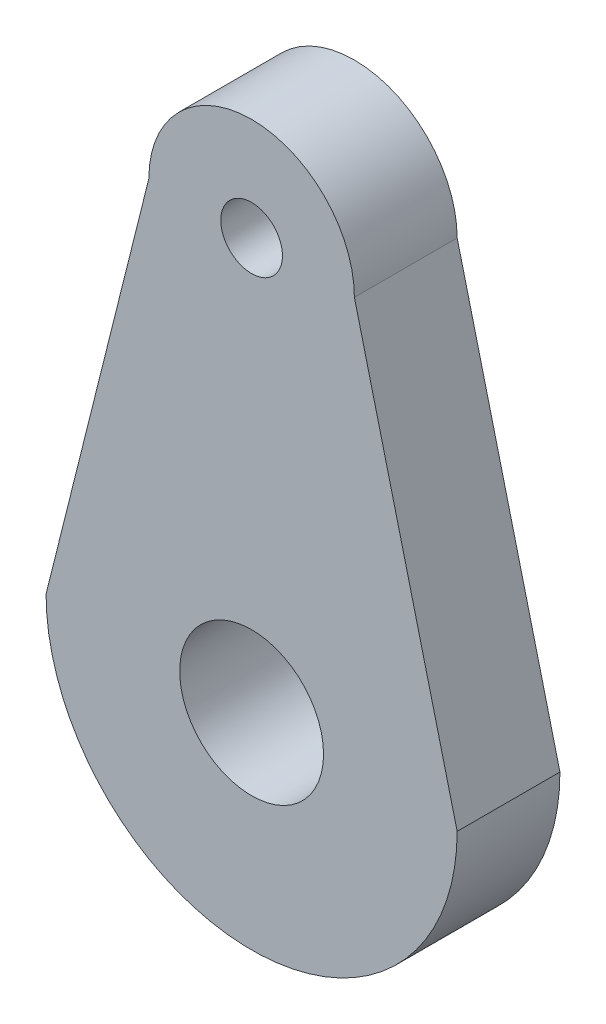
ISO-10303-21;
HEADER;
FILE_DESCRIPTION(('STEP AP214'),'2;1');
FILE_NAME('part.step','',(''),(''),'','','');
FILE_SCHEMA(('AUTOMOTIVE_DESIGN { 1 0 10303 214 1 1 1 1 }'));
ENDSEC;
DATA;
#1=APPLICATION_CONTEXT('core data for automotive mechanical design processes');
#2=APPLICATION_PROTOCOL_DEFINITION('international standard','automotive_design',2000,#1);
#3=PRODUCT_CONTEXT('',#1,'mechanical');
#4=PRODUCT('Part','Part','',(#3));
#5=PRODUCT_RELATED_PRODUCT_CATEGORY('part','',(#4));
#6=PRODUCT_DEFINITION_FORMATION('','',#4);
#7=PRODUCT_DEFINITION_CONTEXT('part definition',#1,'design');
#8=PRODUCT_DEFINITION('design','',#6,#7);
#9=PRODUCT_DEFINITION_SHAPE('','',#8);
#10=(LENGTH_UNIT() NAMED_UNIT(*) SI_UNIT(.MILLI.,.METRE.));
#11=(NAMED_UNIT(*) PLANE_ANGLE_UNIT() SI_UNIT($,.RADIAN.));
#12=(NAMED_UNIT(*) SI_UNIT($,.STERADIAN.) SOLID_ANGLE_UNIT());
#13=UNCERTAINTY_MEASURE_WITH_UNIT(LENGTH_MEASURE(1.E-05),#10,'distance_accuracy_value','');
#14=(GEOMETRIC_REPRESENTATION_CONTEXT(3) GLOBAL_UNCERTAINTY_ASSIGNED_CONTEXT((#13)) GLOBAL_UNIT_ASSIGNED_CONTEXT((#10,
#11,#12)) REPRESENTATION_CONTEXT('',''));
#15=CARTESIAN_POINT('',(0.,0.,0.));
#16=DIRECTION('',(0.,0.,1.));
#17=DIRECTION('',(1.,0.,0.));
#18=AXIS2_PLACEMENT_3D('',#15,#16,#17);
#19=CARTESIAN_POINT('',(0.,10.,5.));
#20=DIRECTION('',(0.,0.,1.));
#21=DIRECTION('',(1.,0.,0.));
#22=AXIS2_PLACEMENT_3D('',#19,#20,#21);
#23=PLANE('',#22);
#24=CARTESIAN_POINT('',(0.,-9.99999999999999,5.));
#25=DIRECTION('',(0.,0.,1.));
#26=DIRECTION('',(1.,0.,0.));
#27=AXIS2_PLACEMENT_3D('',#24,#25,#26);
#28=CIRCLE('',#27,3.5);
#29=CARTESIAN_POINT('',(3.5,-9.99999999999999,5.));
#30=VERTEX_POINT('',#29);
#31=EDGE_CURVE('E102',#30,#30,#28,.T.);
#32=ORIENTED_EDGE('',*,*,#31,.F.);
#33=EDGE_LOOP('',(#32));
#34=FACE_BOUND('',#33,.T.);
#35=CARTESIAN_POINT('',(0.,10.,5.));
#36=DIRECTION('',(0.,0.,1.));
#37=DIRECTION('',(1.,0.,0.));
#38=AXIS2_PLACEMENT_3D('',#35,#36,#37);
#39=CIRCLE('',#38,5.);
#40=CARTESIAN_POINT('',(5.,10.,5.));
#41=VERTEX_POINT('',#40);
#42=CARTESIAN_POINT('',(-5.,10.,5.));
#43=VERTEX_POINT('',#42);
#44=EDGE_CURVE('E87',#41,#43,#39,.T.);
#45=ORIENTED_EDGE('',*,*,#44,.T.);
#46=DIRECTION('',(-0.242535625036333,-0.970142500145332,0.));
#47=VECTOR('',#46,1.);
#48=CARTESIAN_POINT('',(-5.,10.,5.));
#49=LINE('',#48,#47);
#50=CARTESIAN_POINT('',(-10.,-9.99999999999999,5.));
#51=VERTEX_POINT('',#50);
#52=EDGE_CURVE('E82',#43,#51,#49,.T.);
#53=ORIENTED_EDGE('',*,*,#52,.T.);
#54=CARTESIAN_POINT('',(0.,-9.99999999999999,5.));
#55=DIRECTION('',(0.,0.,1.));
#56=DIRECTION('',(1.,0.,0.));
#57=AXIS2_PLACEMENT_3D('',#54,#55,#56);
#58=CIRCLE('',#57,10.);
#59=CARTESIAN_POINT('',(10.,-9.99999999999999,5.));
#60=VERTEX_POINT('',#59);
#61=EDGE_CURVE('E85',#51,#60,#58,.T.);
#62=ORIENTED_EDGE('',*,*,#61,.T.);
#63=DIRECTION('',(-0.242535625036333,0.970142500145332,0.));
#64=VECTOR('',#63,1.);
#65=CARTESIAN_POINT('',(5.,10.,5.));
#66=LINE('',#65,#64);
#67=EDGE_CURVE('E52',#60,#41,#66,.T.);
#68=ORIENTED_EDGE('',*,*,#67,.T.);
#69=EDGE_LOOP('',(#45,#53,#62,#68));
#70=FACE_BOUND('',#69,.T.);
#71=CARTESIAN_POINT('',(0.,10.,5.));
#72=DIRECTION('',(0.,0.,1.));
#73=DIRECTION('',(1.,0.,0.));
#74=AXIS2_PLACEMENT_3D('',#71,#72,#73);
#75=CIRCLE('',#74,1.5);
#76=CARTESIAN_POINT('',(1.5,10.,5.));
#77=VERTEX_POINT('',#76);
#78=EDGE_CURVE('E117',#77,#77,#75,.T.);
#79=ORIENTED_EDGE('',*,*,#78,.F.);
#80=EDGE_LOOP('',(#79));
#81=FACE_BOUND('',#80,.T.);
#82=ADVANCED_FACE('F35',(#34,#70,#81),#23,.T.);
#83=CARTESIAN_POINT('',(0.,10.,0.));
#84=DIRECTION('',(0.,0.,1.));
#85=DIRECTION('',(1.,0.,0.));
#86=AXIS2_PLACEMENT_3D('',#83,#84,#85);
#87=PLANE('',#86);
#88=CARTESIAN_POINT('',(0.,10.,0.));
#89=DIRECTION('',(0.,0.,1.));
#90=DIRECTION('',(1.,0.,0.));
#91=AXIS2_PLACEMENT_3D('',#88,#89,#90);
#92=CIRCLE('',#91,5.);
#93=CARTESIAN_POINT('',(5.,10.,0.));
#94=VERTEX_POINT('',#93);
#95=CARTESIAN_POINT('',(-5.,10.,0.));
#96=VERTEX_POINT('',#95);
#97=EDGE_CURVE('E99',#94,#96,#92,.T.);
#98=ORIENTED_EDGE('',*,*,#97,.F.);
#99=DIRECTION('',(-0.242535625036333,0.970142500145332,0.));
#100=VECTOR('',#99,1.);
#101=CARTESIAN_POINT('',(5.,10.,0.));
#102=LINE('',#101,#100);
#103=CARTESIAN_POINT('',(10.,-9.99999999999999,0.));
#104=VERTEX_POINT('',#103);
#105=EDGE_CURVE('E75',#104,#94,#102,.T.);
#106=ORIENTED_EDGE('',*,*,#105,.F.);
#107=CARTESIAN_POINT('',(0.,-9.99999999999999,0.));
#108=DIRECTION('',(0.,0.,1.));
#109=DIRECTION('',(1.,0.,0.));
#110=AXIS2_PLACEMENT_3D('',#107,#108,#109);
#111=CIRCLE('',#110,10.);
#112=CARTESIAN_POINT('',(-10.,-9.99999999999999,0.));
#113=VERTEX_POINT('',#112);
#114=EDGE_CURVE('E69',#113,#104,#111,.T.);
#115=ORIENTED_EDGE('',*,*,#114,.F.);
#116=DIRECTION('',(-0.242535625036333,-0.970142500145332,0.));
#117=VECTOR('',#116,1.);
#118=CARTESIAN_POINT('',(-5.,10.,0.));
#119=LINE('',#118,#117);
#120=EDGE_CURVE('E91',#96,#113,#119,.T.);
#121=ORIENTED_EDGE('',*,*,#120,.F.);
#122=EDGE_LOOP('',(#98,#106,#115,#121));
#123=FACE_BOUND('',#122,.T.);
#124=CARTESIAN_POINT('',(0.,-9.99999999999999,0.));
#125=DIRECTION('',(0.,0.,1.));
#126=DIRECTION('',(1.,0.,0.));
#127=AXIS2_PLACEMENT_3D('',#124,#125,#126);
#128=CIRCLE('',#127,3.5);
#129=CARTESIAN_POINT('',(3.5,-9.99999999999999,0.));
#130=VERTEX_POINT('',#129);
#131=EDGE_CURVE('E114',#130,#130,#128,.T.);
#132=ORIENTED_EDGE('',*,*,#131,.T.);
#133=EDGE_LOOP('',(#132));
#134=FACE_BOUND('',#133,.T.);
#135=CARTESIAN_POINT('',(0.,10.,0.));
#136=DIRECTION('',(0.,0.,1.));
#137=DIRECTION('',(1.,0.,0.));
#138=AXIS2_PLACEMENT_3D('',#135,#136,#137);
#139=CIRCLE('',#138,1.5);
#140=CARTESIAN_POINT('',(1.5,10.,0.));
#141=VERTEX_POINT('',#140);
#142=EDGE_CURVE('E120',#141,#141,#139,.T.);
#143=ORIENTED_EDGE('',*,*,#142,.T.);
#144=EDGE_LOOP('',(#143));
#145=FACE_BOUND('',#144,.T.);
#146=ADVANCED_FACE('F110',(#123,#134,#145),#87,.F.);
#147=CARTESIAN_POINT('',(0.,10.,5.));
#148=DIRECTION('',(0.,0.,-1.));
#149=DIRECTION('',(-1.,0.,0.));
#150=AXIS2_PLACEMENT_3D('',#147,#148,#149);
#151=CYLINDRICAL_SURFACE('',#150,5.);
#152=ORIENTED_EDGE('',*,*,#97,.T.);
#153=DIRECTION('',(0.,0.,-1.));
#154=VECTOR('',#153,1.);
#155=CARTESIAN_POINT('',(-5.,10.,5.));
#156=LINE('',#155,#154);
#157=EDGE_CURVE('E11',#43,#96,#156,.T.);
#158=ORIENTED_EDGE('',*,*,#157,.F.);
#159=ORIENTED_EDGE('',*,*,#44,.F.);
#160=DIRECTION('',(0.,0.,-1.));
#161=VECTOR('',#160,1.);
#162=CARTESIAN_POINT('',(5.,10.,5.));
#163=LINE('',#162,#161);
#164=EDGE_CURVE('E95',#41,#94,#163,.T.);
#165=ORIENTED_EDGE('',*,*,#164,.T.);
#166=EDGE_LOOP('',(#152,#158,#159,#165));
#167=FACE_BOUND('',#166,.T.);
#168=ADVANCED_FACE('F37',(#167),#151,.T.);
#169=CARTESIAN_POINT('',(-5.,10.,5.));
#170=DIRECTION('',(0.970142500145332,-0.242535625036333,0.));
#171=DIRECTION('',(0.242535625036333,0.970142500145332,0.));
#172=AXIS2_PLACEMENT_3D('',#169,#170,#171);
#173=PLANE('',#172);
#174=ORIENTED_EDGE('',*,*,#120,.T.);
#175=DIRECTION('',(0.,0.,-1.));
#176=VECTOR('',#175,1.);
#177=CARTESIAN_POINT('',(-10.,-9.99999999999999,5.));
#178=LINE('',#177,#176);
#179=EDGE_CURVE('E44',#51,#113,#178,.T.);
#180=ORIENTED_EDGE('',*,*,#179,.F.);
#181=ORIENTED_EDGE('',*,*,#52,.F.);
#182=ORIENTED_EDGE('',*,*,#157,.T.);
#183=EDGE_LOOP('',(#174,#180,#181,#182));
#184=FACE_BOUND('',#183,.T.);
#185=ADVANCED_FACE('F90',(#184),#173,.F.);
#186=CARTESIAN_POINT('',(0.,-9.99999999999999,5.));
#187=DIRECTION('',(0.,0.,-1.));
#188=DIRECTION('',(-1.,0.,0.));
#189=AXIS2_PLACEMENT_3D('',#186,#187,#188);
#190=CYLINDRICAL_SURFACE('',#189,10.);
#191=ORIENTED_EDGE('',*,*,#114,.T.);
#192=DIRECTION('',(0.,0.,-1.));
#193=VECTOR('',#192,1.);
#194=CARTESIAN_POINT('',(10.,-9.99999999999999,5.));
#195=LINE('',#194,#193);
#196=EDGE_CURVE('E92',#60,#104,#195,.T.);
#197=ORIENTED_EDGE('',*,*,#196,.F.);
#198=ORIENTED_EDGE('',*,*,#61,.F.);
#199=ORIENTED_EDGE('',*,*,#179,.T.);
#200=EDGE_LOOP('',(#191,#197,#198,#199));
#201=FACE_BOUND('',#200,.T.);
#202=ADVANCED_FACE('F93',(#201),#190,.T.);
#203=CARTESIAN_POINT('',(5.,10.,5.));
#204=DIRECTION('',(-0.970142500145332,-0.242535625036333,0.));
#205=DIRECTION('',(0.242535625036333,-0.970142500145332,0.));
#206=AXIS2_PLACEMENT_3D('',#203,#204,#205);
#207=PLANE('',#206);
#208=ORIENTED_EDGE('',*,*,#105,.T.);
#209=ORIENTED_EDGE('',*,*,#164,.F.);
#210=ORIENTED_EDGE('',*,*,#67,.F.);
#211=ORIENTED_EDGE('',*,*,#196,.T.);
#212=EDGE_LOOP('',(#208,#209,#210,#211));
#213=FACE_BOUND('',#212,.T.);
#214=ADVANCED_FACE('F107',(#213),#207,.F.);
#215=CARTESIAN_POINT('',(0.,-9.99999999999999,5.));
#216=DIRECTION('',(0.,0.,-1.));
#217=DIRECTION('',(-1.,0.,0.));
#218=AXIS2_PLACEMENT_3D('',#215,#216,#217);
#219=CYLINDRICAL_SURFACE('',#218,3.5);
#220=ORIENTED_EDGE('',*,*,#31,.T.);
#221=EDGE_LOOP('',(#220));
#222=FACE_BOUND('',#221,.T.);
#223=ORIENTED_EDGE('',*,*,#131,.F.);
#224=EDGE_LOOP('',(#223));
#225=FACE_BOUND('',#224,.T.);
#226=ADVANCED_FACE('F137',(#222,#225),#219,.F.);
#227=CARTESIAN_POINT('',(0.,10.,5.));
#228=DIRECTION('',(0.,0.,-1.));
#229=DIRECTION('',(-1.,0.,0.));
#230=AXIS2_PLACEMENT_3D('',#227,#228,#229);
#231=CYLINDRICAL_SURFACE('',#230,1.5);
#232=ORIENTED_EDGE('',*,*,#78,.T.);
#233=EDGE_LOOP('',(#232));
#234=FACE_BOUND('',#233,.T.);
#235=ORIENTED_EDGE('',*,*,#142,.F.);
#236=EDGE_LOOP('',(#235));
#237=FACE_BOUND('',#236,.T.);
#238=ADVANCED_FACE('F126',(#234,#237),#231,.F.);
#239=CLOSED_SHELL('',(#82,#146,#168,#185,#202,#214,#226,#238));
#240=MANIFOLD_SOLID_BREP('B2',#239);
#241=ADVANCED_BREP_SHAPE_REPRESENTATION('',(#18,#240),#14);
#242=SHAPE_DEFINITION_REPRESENTATION(#9,#241);
ENDSEC;
END-ISO-10303-21;
